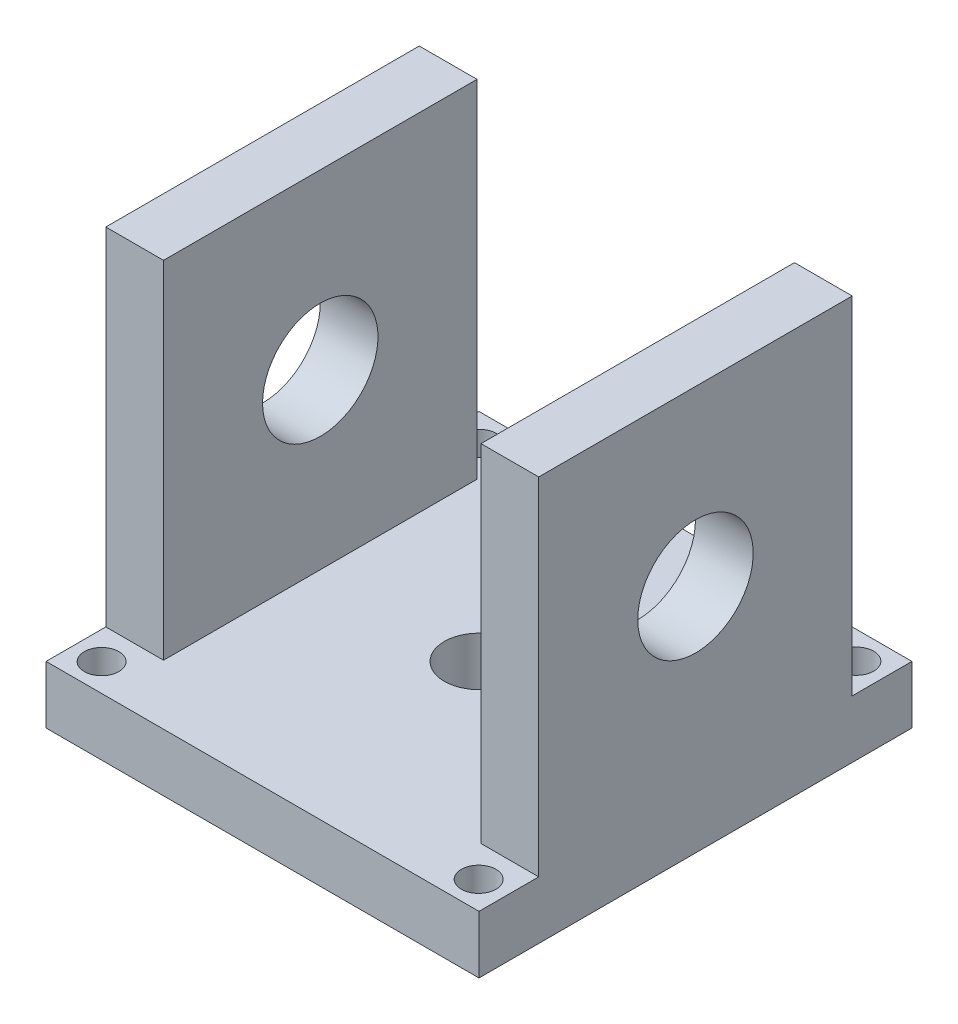
ISO-10303-21;
HEADER;
FILE_DESCRIPTION(('STEP AP214'),'2;1');
FILE_NAME('part.step','',(''),(''),'','','');
FILE_SCHEMA(('AUTOMOTIVE_DESIGN { 1 0 10303 214 1 1 1 1 }'));
ENDSEC;
DATA;
#1=APPLICATION_CONTEXT('core data for automotive mechanical design processes');
#2=APPLICATION_PROTOCOL_DEFINITION('international standard','automotive_design',2000,#1);
#3=PRODUCT_CONTEXT('',#1,'mechanical');
#4=PRODUCT('Part','Part','',(#3));
#5=PRODUCT_RELATED_PRODUCT_CATEGORY('part','',(#4));
#6=PRODUCT_DEFINITION_FORMATION('','',#4);
#7=PRODUCT_DEFINITION_CONTEXT('part definition',#1,'design');
#8=PRODUCT_DEFINITION('design','',#6,#7);
#9=PRODUCT_DEFINITION_SHAPE('','',#8);
#10=(LENGTH_UNIT() NAMED_UNIT(*) SI_UNIT(.MILLI.,.METRE.));
#11=(NAMED_UNIT(*) PLANE_ANGLE_UNIT() SI_UNIT($,.RADIAN.));
#12=(NAMED_UNIT(*) SI_UNIT($,.STERADIAN.) SOLID_ANGLE_UNIT());
#13=UNCERTAINTY_MEASURE_WITH_UNIT(LENGTH_MEASURE(1.E-05),#10,'distance_accuracy_value','');
#14=(GEOMETRIC_REPRESENTATION_CONTEXT(3) GLOBAL_UNCERTAINTY_ASSIGNED_CONTEXT((#13)) GLOBAL_UNIT_ASSIGNED_CONTEXT((#10,
#11,#12)) REPRESENTATION_CONTEXT('',''));
#15=CARTESIAN_POINT('',(0.,0.,0.));
#16=DIRECTION('',(0.,0.,1.));
#17=DIRECTION('',(1.,0.,0.));
#18=AXIS2_PLACEMENT_3D('',#15,#16,#17);
#19=CARTESIAN_POINT('',(0.,10.,0.));
#20=DIRECTION('',(0.,-1.,0.));
#21=DIRECTION('',(0.,0.,-1.));
#22=AXIS2_PLACEMENT_3D('',#19,#20,#21);
#23=PLANE('',#22);
#24=CARTESIAN_POINT('',(-32.66,10.,-32.72));
#25=DIRECTION('',(0.,1.,0.));
#26=DIRECTION('',(0.,0.,1.));
#27=AXIS2_PLACEMENT_3D('',#24,#25,#26);
#28=CIRCLE('',#27,3.);
#29=CARTESIAN_POINT('',(-32.66,10.,-29.72));
#30=VERTEX_POINT('',#29);
#31=EDGE_CURVE('E210',#30,#30,#28,.T.);
#32=ORIENTED_EDGE('',*,*,#31,.F.);
#33=EDGE_LOOP('',(#32));
#34=FACE_BOUND('',#33,.T.);
#35=CARTESIAN_POINT('',(32.66,10.,-32.72));
#36=DIRECTION('',(0.,1.,0.));
#37=DIRECTION('',(0.,0.,-1.));
#38=AXIS2_PLACEMENT_3D('',#35,#36,#37);
#39=CIRCLE('',#38,3.);
#40=CARTESIAN_POINT('',(32.66,10.,-35.72));
#41=VERTEX_POINT('',#40);
#42=EDGE_CURVE('E204',#41,#41,#39,.T.);
#43=ORIENTED_EDGE('',*,*,#42,.F.);
#44=EDGE_LOOP('',(#43));
#45=FACE_BOUND('',#44,.T.);
#46=CARTESIAN_POINT('',(32.66,10.,32.72));
#47=DIRECTION('',(0.,1.,0.));
#48=DIRECTION('',(0.,0.,1.));
#49=AXIS2_PLACEMENT_3D('',#46,#47,#48);
#50=CIRCLE('',#49,3.);
#51=CARTESIAN_POINT('',(32.66,10.,35.72));
#52=VERTEX_POINT('',#51);
#53=EDGE_CURVE('E198',#52,#52,#50,.T.);
#54=ORIENTED_EDGE('',*,*,#53,.F.);
#55=EDGE_LOOP('',(#54));
#56=FACE_BOUND('',#55,.T.);
#57=CARTESIAN_POINT('',(-32.66,10.,32.72));
#58=DIRECTION('',(0.,1.,0.));
#59=DIRECTION('',(0.,0.,-1.));
#60=AXIS2_PLACEMENT_3D('',#57,#58,#59);
#61=CIRCLE('',#60,3.);
#62=CARTESIAN_POINT('',(-32.66,10.,29.72));
#63=VERTEX_POINT('',#62);
#64=EDGE_CURVE('E192',#63,#63,#61,.T.);
#65=ORIENTED_EDGE('',*,*,#64,.F.);
#66=EDGE_LOOP('',(#65));
#67=FACE_BOUND('',#66,.T.);
#68=CARTESIAN_POINT('',(0.,10.,0.));
#69=DIRECTION('',(0.,1.,0.));
#70=DIRECTION('',(0.,0.,1.));
#71=AXIS2_PLACEMENT_3D('',#68,#69,#70);
#72=CIRCLE('',#71,6.);
#73=CARTESIAN_POINT('',(0.,10.,6.));
#74=VERTEX_POINT('',#73);
#75=EDGE_CURVE('E186',#74,#74,#72,.T.);
#76=ORIENTED_EDGE('',*,*,#75,.F.);
#77=EDGE_LOOP('',(#76));
#78=FACE_BOUND('',#77,.T.);
#79=DIRECTION('',(-1.,0.,0.));
#80=VECTOR('',#79,1.);
#81=CARTESIAN_POINT('',(37.5,10.,-27.154127805021));
#82=LINE('',#81,#80);
#83=CARTESIAN_POINT('',(37.5,10.,-27.154127805021));
#84=VERTEX_POINT('',#83);
#85=CARTESIAN_POINT('',(27.5,10.,-27.154127805021));
#86=VERTEX_POINT('',#85);
#87=EDGE_CURVE('E468',#84,#86,#82,.T.);
#88=ORIENTED_EDGE('',*,*,#87,.F.);
#89=DIRECTION('',(0.,0.,-1.));
#90=VECTOR('',#89,1.);
#91=CARTESIAN_POINT('',(37.5,10.,-37.5));
#92=LINE('',#91,#90);
#93=CARTESIAN_POINT('',(37.5,10.,-37.5));
#94=VERTEX_POINT('',#93);
#95=EDGE_CURVE('E149',#84,#94,#92,.T.);
#96=ORIENTED_EDGE('',*,*,#95,.T.);
#97=DIRECTION('',(-1.,0.,0.));
#98=VECTOR('',#97,1.);
#99=CARTESIAN_POINT('',(37.5,10.,-37.5));
#100=LINE('',#99,#98);
#101=CARTESIAN_POINT('',(-37.5,10.,-37.5));
#102=VERTEX_POINT('',#101);
#103=EDGE_CURVE('E223',#94,#102,#100,.T.);
#104=ORIENTED_EDGE('',*,*,#103,.T.);
#105=DIRECTION('',(0.,0.,1.));
#106=VECTOR('',#105,1.);
#107=CARTESIAN_POINT('',(-37.5,10.,-37.5));
#108=LINE('',#107,#106);
#109=CARTESIAN_POINT('',(-37.5,10.,-27.154127805021));
#110=VERTEX_POINT('',#109);
#111=EDGE_CURVE('E216',#102,#110,#108,.T.);
#112=ORIENTED_EDGE('',*,*,#111,.T.);
#113=DIRECTION('',(-1.,0.,0.));
#114=VECTOR('',#113,1.);
#115=CARTESIAN_POINT('',(-37.5,10.,-27.154127805021));
#116=LINE('',#115,#114);
#117=CARTESIAN_POINT('',(-27.5,10.,-27.154127805021));
#118=VERTEX_POINT('',#117);
#119=EDGE_CURVE('E163',#118,#110,#116,.T.);
#120=ORIENTED_EDGE('',*,*,#119,.F.);
#121=DIRECTION('',(0.,0.,-1.));
#122=VECTOR('',#121,1.);
#123=CARTESIAN_POINT('',(-27.5,10.,-27.154127805021));
#124=LINE('',#123,#122);
#125=CARTESIAN_POINT('',(-27.5,10.,27.154127805021));
#126=VERTEX_POINT('',#125);
#127=EDGE_CURVE('E153',#126,#118,#124,.T.);
#128=ORIENTED_EDGE('',*,*,#127,.F.);
#129=DIRECTION('',(1.,0.,0.));
#130=VECTOR('',#129,1.);
#131=CARTESIAN_POINT('',(-37.5,10.,27.154127805021));
#132=LINE('',#131,#130);
#133=CARTESIAN_POINT('',(-37.5,10.,27.154127805021));
#134=VERTEX_POINT('',#133);
#135=EDGE_CURVE('E150',#134,#126,#132,.T.);
#136=ORIENTED_EDGE('',*,*,#135,.F.);
#137=CARTESIAN_POINT('',(-37.5,10.,37.5));
#138=VERTEX_POINT('',#137);
#139=EDGE_CURVE('E219',#134,#138,#108,.T.);
#140=ORIENTED_EDGE('',*,*,#139,.T.);
#141=DIRECTION('',(1.,0.,0.));
#142=VECTOR('',#141,1.);
#143=CARTESIAN_POINT('',(37.5,10.,37.5));
#144=LINE('',#143,#142);
#145=CARTESIAN_POINT('',(37.5,10.,37.5));
#146=VERTEX_POINT('',#145);
#147=EDGE_CURVE('E218',#138,#146,#144,.T.);
#148=ORIENTED_EDGE('',*,*,#147,.T.);
#149=CARTESIAN_POINT('',(37.5,10.,27.154127805021));
#150=VERTEX_POINT('',#149);
#151=EDGE_CURVE('E221',#146,#150,#92,.T.);
#152=ORIENTED_EDGE('',*,*,#151,.T.);
#153=DIRECTION('',(1.,0.,0.));
#154=VECTOR('',#153,1.);
#155=CARTESIAN_POINT('',(37.5,10.,27.154127805021));
#156=LINE('',#155,#154);
#157=CARTESIAN_POINT('',(27.5,10.,27.154127805021));
#158=VERTEX_POINT('',#157);
#159=EDGE_CURVE('E59',#158,#150,#156,.T.);
#160=ORIENTED_EDGE('',*,*,#159,.F.);
#161=DIRECTION('',(0.,0.,1.));
#162=VECTOR('',#161,1.);
#163=CARTESIAN_POINT('',(27.5,10.,-27.154127805021));
#164=LINE('',#163,#162);
#165=EDGE_CURVE('E54',#86,#158,#164,.T.);
#166=ORIENTED_EDGE('',*,*,#165,.F.);
#167=EDGE_LOOP('',(#88,#96,#104,#112,#120,#128,#136,#140,#148,#152,#160,#166));
#168=FACE_BOUND('',#167,.T.);
#169=ADVANCED_FACE('F38',(#34,#45,#56,#67,#78,#168),#23,.F.);
#170=CARTESIAN_POINT('',(0.,0.,0.));
#171=DIRECTION('',(0.,-1.,0.));
#172=DIRECTION('',(0.,0.,-1.));
#173=AXIS2_PLACEMENT_3D('',#170,#171,#172);
#174=PLANE('',#173);
#175=CARTESIAN_POINT('',(-32.66,0.,32.72));
#176=DIRECTION('',(0.,1.,0.));
#177=DIRECTION('',(0.,0.,-1.));
#178=AXIS2_PLACEMENT_3D('',#175,#176,#177);
#179=CIRCLE('',#178,3.);
#180=CARTESIAN_POINT('',(-32.66,0.,29.72));
#181=VERTEX_POINT('',#180);
#182=EDGE_CURVE('E189',#181,#181,#179,.T.);
#183=ORIENTED_EDGE('',*,*,#182,.T.);
#184=EDGE_LOOP('',(#183));
#185=FACE_BOUND('',#184,.T.);
#186=CARTESIAN_POINT('',(32.66,0.,-32.72));
#187=DIRECTION('',(0.,1.,0.));
#188=DIRECTION('',(0.,0.,-1.));
#189=AXIS2_PLACEMENT_3D('',#186,#187,#188);
#190=CIRCLE('',#189,3.);
#191=CARTESIAN_POINT('',(32.66,0.,-35.72));
#192=VERTEX_POINT('',#191);
#193=EDGE_CURVE('E201',#192,#192,#190,.T.);
#194=ORIENTED_EDGE('',*,*,#193,.T.);
#195=EDGE_LOOP('',(#194));
#196=FACE_BOUND('',#195,.T.);
#197=DIRECTION('',(0.,0.,1.));
#198=VECTOR('',#197,1.);
#199=CARTESIAN_POINT('',(-37.5,0.,-37.5));
#200=LINE('',#199,#198);
#201=CARTESIAN_POINT('',(-37.5,0.,-37.5));
#202=VERTEX_POINT('',#201);
#203=CARTESIAN_POINT('',(-37.5,0.,37.5));
#204=VERTEX_POINT('',#203);
#205=EDGE_CURVE('E213',#202,#204,#200,.T.);
#206=ORIENTED_EDGE('',*,*,#205,.F.);
#207=DIRECTION('',(-1.,0.,0.));
#208=VECTOR('',#207,1.);
#209=CARTESIAN_POINT('',(37.5,0.,-37.5));
#210=LINE('',#209,#208);
#211=CARTESIAN_POINT('',(37.5,0.,-37.5));
#212=VERTEX_POINT('',#211);
#213=EDGE_CURVE('E232',#212,#202,#210,.T.);
#214=ORIENTED_EDGE('',*,*,#213,.F.);
#215=DIRECTION('',(0.,0.,-1.));
#216=VECTOR('',#215,1.);
#217=CARTESIAN_POINT('',(37.5,0.,-37.5));
#218=LINE('',#217,#216);
#219=CARTESIAN_POINT('',(37.5,0.,37.5));
#220=VERTEX_POINT('',#219);
#221=EDGE_CURVE('E230',#220,#212,#218,.T.);
#222=ORIENTED_EDGE('',*,*,#221,.F.);
#223=DIRECTION('',(1.,0.,0.));
#224=VECTOR('',#223,1.);
#225=CARTESIAN_POINT('',(37.5,0.,37.5));
#226=LINE('',#225,#224);
#227=EDGE_CURVE('E228',#204,#220,#226,.T.);
#228=ORIENTED_EDGE('',*,*,#227,.F.);
#229=EDGE_LOOP('',(#206,#214,#222,#228));
#230=FACE_BOUND('',#229,.T.);
#231=CARTESIAN_POINT('',(-32.66,0.,-32.72));
#232=DIRECTION('',(0.,1.,0.));
#233=DIRECTION('',(0.,0.,1.));
#234=AXIS2_PLACEMENT_3D('',#231,#232,#233);
#235=CIRCLE('',#234,3.);
#236=CARTESIAN_POINT('',(-32.66,0.,-29.72));
#237=VERTEX_POINT('',#236);
#238=EDGE_CURVE('E207',#237,#237,#235,.T.);
#239=ORIENTED_EDGE('',*,*,#238,.T.);
#240=EDGE_LOOP('',(#239));
#241=FACE_BOUND('',#240,.T.);
#242=CARTESIAN_POINT('',(32.66,0.,32.72));
#243=DIRECTION('',(0.,1.,0.));
#244=DIRECTION('',(0.,0.,1.));
#245=AXIS2_PLACEMENT_3D('',#242,#243,#244);
#246=CIRCLE('',#245,3.);
#247=CARTESIAN_POINT('',(32.66,0.,35.72));
#248=VERTEX_POINT('',#247);
#249=EDGE_CURVE('E195',#248,#248,#246,.T.);
#250=ORIENTED_EDGE('',*,*,#249,.T.);
#251=EDGE_LOOP('',(#250));
#252=FACE_BOUND('',#251,.T.);
#253=CARTESIAN_POINT('',(0.,0.,0.));
#254=DIRECTION('',(0.,1.,0.));
#255=DIRECTION('',(0.,0.,1.));
#256=AXIS2_PLACEMENT_3D('',#253,#254,#255);
#257=CIRCLE('',#256,6.);
#258=CARTESIAN_POINT('',(0.,0.,6.));
#259=VERTEX_POINT('',#258);
#260=EDGE_CURVE('E185',#259,#259,#257,.T.);
#261=ORIENTED_EDGE('',*,*,#260,.T.);
#262=EDGE_LOOP('',(#261));
#263=FACE_BOUND('',#262,.T.);
#264=ADVANCED_FACE('F248',(#185,#196,#230,#241,#252,#263),#174,.T.);
#265=CARTESIAN_POINT('',(-37.5,10.,-37.5));
#266=DIRECTION('',(1.,0.,0.));
#267=DIRECTION('',(0.,0.,-1.));
#268=AXIS2_PLACEMENT_3D('',#265,#266,#267);
#269=PLANE('',#268);
#270=CARTESIAN_POINT('',(-37.5,40.,0.));
#271=DIRECTION('',(1.,0.,0.));
#272=DIRECTION('',(0.,0.,-1.));
#273=AXIS2_PLACEMENT_3D('',#270,#271,#272);
#274=CIRCLE('',#273,10.);
#275=CARTESIAN_POINT('',(-37.5,40.,-10.));
#276=VERTEX_POINT('',#275);
#277=EDGE_CURVE('E467',#276,#276,#274,.T.);
#278=ORIENTED_EDGE('',*,*,#277,.T.);
#279=EDGE_LOOP('',(#278));
#280=FACE_BOUND('',#279,.T.);
#281=ORIENTED_EDGE('',*,*,#205,.T.);
#282=DIRECTION('',(0.,-1.,0.));
#283=VECTOR('',#282,1.);
#284=CARTESIAN_POINT('',(-37.5,10.,37.5));
#285=LINE('',#284,#283);
#286=EDGE_CURVE('E11',#138,#204,#285,.T.);
#287=ORIENTED_EDGE('',*,*,#286,.F.);
#288=ORIENTED_EDGE('',*,*,#139,.F.);
#289=DIRECTION('',(0.,-1.,0.));
#290=VECTOR('',#289,1.);
#291=CARTESIAN_POINT('',(-37.5,70.,27.154127805021));
#292=LINE('',#291,#290);
#293=CARTESIAN_POINT('',(-37.5,70.,27.154127805021));
#294=VERTEX_POINT('',#293);
#295=EDGE_CURVE('E182',#294,#134,#292,.T.);
#296=ORIENTED_EDGE('',*,*,#295,.F.);
#297=DIRECTION('',(0.,0.,1.));
#298=VECTOR('',#297,1.);
#299=CARTESIAN_POINT('',(-37.5,70.,-27.154127805021));
#300=LINE('',#299,#298);
#301=CARTESIAN_POINT('',(-37.5,70.,-27.154127805021));
#302=VERTEX_POINT('',#301);
#303=EDGE_CURVE('E159',#302,#294,#300,.T.);
#304=ORIENTED_EDGE('',*,*,#303,.F.);
#305=DIRECTION('',(0.,-1.,0.));
#306=VECTOR('',#305,1.);
#307=CARTESIAN_POINT('',(-37.5,70.,-27.154127805021));
#308=LINE('',#307,#306);
#309=EDGE_CURVE('E168',#302,#110,#308,.T.);
#310=ORIENTED_EDGE('',*,*,#309,.T.);
#311=ORIENTED_EDGE('',*,*,#111,.F.);
#312=DIRECTION('',(0.,-1.,0.));
#313=VECTOR('',#312,1.);
#314=CARTESIAN_POINT('',(-37.5,10.,-37.5));
#315=LINE('',#314,#313);
#316=EDGE_CURVE('E225',#102,#202,#315,.T.);
#317=ORIENTED_EDGE('',*,*,#316,.T.);
#318=EDGE_LOOP('',(#281,#287,#288,#296,#304,#310,#311,#317));
#319=FACE_BOUND('',#318,.T.);
#320=ADVANCED_FACE('F40',(#280,#319),#269,.F.);
#321=CARTESIAN_POINT('',(37.5,10.,37.5));
#322=DIRECTION('',(0.,0.,-1.));
#323=DIRECTION('',(-1.,0.,0.));
#324=AXIS2_PLACEMENT_3D('',#321,#322,#323);
#325=PLANE('',#324);
#326=ORIENTED_EDGE('',*,*,#227,.T.);
#327=DIRECTION('',(0.,-1.,0.));
#328=VECTOR('',#327,1.);
#329=CARTESIAN_POINT('',(37.5,10.,37.5));
#330=LINE('',#329,#328);
#331=EDGE_CURVE('E47',#146,#220,#330,.T.);
#332=ORIENTED_EDGE('',*,*,#331,.F.);
#333=ORIENTED_EDGE('',*,*,#147,.F.);
#334=ORIENTED_EDGE('',*,*,#286,.T.);
#335=EDGE_LOOP('',(#326,#332,#333,#334));
#336=FACE_BOUND('',#335,.T.);
#337=ADVANCED_FACE('F271',(#336),#325,.F.);
#338=CARTESIAN_POINT('',(37.5,10.,-37.5));
#339=DIRECTION('',(-1.,0.,0.));
#340=DIRECTION('',(0.,0.,1.));
#341=AXIS2_PLACEMENT_3D('',#338,#339,#340);
#342=PLANE('',#341);
#343=CARTESIAN_POINT('',(37.5,40.,0.));
#344=DIRECTION('',(-1.,0.,0.));
#345=DIRECTION('',(0.,0.,1.));
#346=AXIS2_PLACEMENT_3D('',#343,#344,#345);
#347=CIRCLE('',#346,10.);
#348=CARTESIAN_POINT('',(37.5,40.,10.));
#349=VERTEX_POINT('',#348);
#350=EDGE_CURVE('E482',#349,#349,#347,.T.);
#351=ORIENTED_EDGE('',*,*,#350,.T.);
#352=EDGE_LOOP('',(#351));
#353=FACE_BOUND('',#352,.T.);
#354=ORIENTED_EDGE('',*,*,#221,.T.);
#355=DIRECTION('',(0.,-1.,0.));
#356=VECTOR('',#355,1.);
#357=CARTESIAN_POINT('',(37.5,10.,-37.5));
#358=LINE('',#357,#356);
#359=EDGE_CURVE('E236',#94,#212,#358,.T.);
#360=ORIENTED_EDGE('',*,*,#359,.F.);
#361=ORIENTED_EDGE('',*,*,#95,.F.);
#362=DIRECTION('',(0.,-1.,0.));
#363=VECTOR('',#362,1.);
#364=CARTESIAN_POINT('',(37.5,70.,-27.154127805021));
#365=LINE('',#364,#363);
#366=CARTESIAN_POINT('',(37.5,70.,-27.154127805021));
#367=VERTEX_POINT('',#366);
#368=EDGE_CURVE('E131',#367,#84,#365,.T.);
#369=ORIENTED_EDGE('',*,*,#368,.F.);
#370=DIRECTION('',(0.,0.,-1.));
#371=VECTOR('',#370,1.);
#372=CARTESIAN_POINT('',(37.5,70.,-27.154127805021));
#373=LINE('',#372,#371);
#374=CARTESIAN_POINT('',(37.5,70.,27.154127805021));
#375=VERTEX_POINT('',#374);
#376=EDGE_CURVE('E137',#375,#367,#373,.T.);
#377=ORIENTED_EDGE('',*,*,#376,.F.);
#378=DIRECTION('',(0.,-1.,0.));
#379=VECTOR('',#378,1.);
#380=CARTESIAN_POINT('',(37.5,70.,27.154127805021));
#381=LINE('',#380,#379);
#382=EDGE_CURVE('E475',#375,#150,#381,.T.);
#383=ORIENTED_EDGE('',*,*,#382,.T.);
#384=ORIENTED_EDGE('',*,*,#151,.F.);
#385=ORIENTED_EDGE('',*,*,#331,.T.);
#386=EDGE_LOOP('',(#354,#360,#361,#369,#377,#383,#384,#385));
#387=FACE_BOUND('',#386,.T.);
#388=ADVANCED_FACE('F147',(#353,#387),#342,.F.);
#389=CARTESIAN_POINT('',(37.5,10.,-37.5));
#390=DIRECTION('',(0.,0.,1.));
#391=DIRECTION('',(1.,0.,0.));
#392=AXIS2_PLACEMENT_3D('',#389,#390,#391);
#393=PLANE('',#392);
#394=ORIENTED_EDGE('',*,*,#213,.T.);
#395=ORIENTED_EDGE('',*,*,#316,.F.);
#396=ORIENTED_EDGE('',*,*,#103,.F.);
#397=ORIENTED_EDGE('',*,*,#359,.T.);
#398=EDGE_LOOP('',(#394,#395,#396,#397));
#399=FACE_BOUND('',#398,.T.);
#400=ADVANCED_FACE('F252',(#399),#393,.F.);
#401=CARTESIAN_POINT('',(-32.66,10.,-32.72));
#402=DIRECTION('',(0.,-1.,0.));
#403=DIRECTION('',(0.,0.,-1.));
#404=AXIS2_PLACEMENT_3D('',#401,#402,#403);
#405=CYLINDRICAL_SURFACE('',#404,3.);
#406=ORIENTED_EDGE('',*,*,#31,.T.);
#407=EDGE_LOOP('',(#406));
#408=FACE_BOUND('',#407,.T.);
#409=ORIENTED_EDGE('',*,*,#238,.F.);
#410=EDGE_LOOP('',(#409));
#411=FACE_BOUND('',#410,.T.);
#412=ADVANCED_FACE('F291',(#408,#411),#405,.F.);
#413=CARTESIAN_POINT('',(32.66,10.,-32.72));
#414=DIRECTION('',(0.,-1.,0.));
#415=DIRECTION('',(0.,0.,-1.));
#416=AXIS2_PLACEMENT_3D('',#413,#414,#415);
#417=CYLINDRICAL_SURFACE('',#416,3.);
#418=ORIENTED_EDGE('',*,*,#42,.T.);
#419=EDGE_LOOP('',(#418));
#420=FACE_BOUND('',#419,.T.);
#421=ORIENTED_EDGE('',*,*,#193,.F.);
#422=EDGE_LOOP('',(#421));
#423=FACE_BOUND('',#422,.T.);
#424=ADVANCED_FACE('F298',(#420,#423),#417,.F.);
#425=CARTESIAN_POINT('',(32.66,10.,32.72));
#426=DIRECTION('',(0.,-1.,0.));
#427=DIRECTION('',(0.,0.,-1.));
#428=AXIS2_PLACEMENT_3D('',#425,#426,#427);
#429=CYLINDRICAL_SURFACE('',#428,3.);
#430=ORIENTED_EDGE('',*,*,#53,.T.);
#431=EDGE_LOOP('',(#430));
#432=FACE_BOUND('',#431,.T.);
#433=ORIENTED_EDGE('',*,*,#249,.F.);
#434=EDGE_LOOP('',(#433));
#435=FACE_BOUND('',#434,.T.);
#436=ADVANCED_FACE('F303',(#432,#435),#429,.F.);
#437=CARTESIAN_POINT('',(-32.66,10.,32.72));
#438=DIRECTION('',(0.,-1.,0.));
#439=DIRECTION('',(0.,0.,-1.));
#440=AXIS2_PLACEMENT_3D('',#437,#438,#439);
#441=CYLINDRICAL_SURFACE('',#440,3.);
#442=ORIENTED_EDGE('',*,*,#64,.T.);
#443=EDGE_LOOP('',(#442));
#444=FACE_BOUND('',#443,.T.);
#445=ORIENTED_EDGE('',*,*,#182,.F.);
#446=EDGE_LOOP('',(#445));
#447=FACE_BOUND('',#446,.T.);
#448=ADVANCED_FACE('F314',(#444,#447),#441,.F.);
#449=CARTESIAN_POINT('',(0.,10.,0.));
#450=DIRECTION('',(0.,-1.,0.));
#451=DIRECTION('',(0.,0.,-1.));
#452=AXIS2_PLACEMENT_3D('',#449,#450,#451);
#453=CYLINDRICAL_SURFACE('',#452,6.);
#454=ORIENTED_EDGE('',*,*,#75,.T.);
#455=EDGE_LOOP('',(#454));
#456=FACE_BOUND('',#455,.T.);
#457=ORIENTED_EDGE('',*,*,#260,.F.);
#458=EDGE_LOOP('',(#457));
#459=FACE_BOUND('',#458,.T.);
#460=ADVANCED_FACE('F312',(#456,#459),#453,.F.);
#461=CARTESIAN_POINT('',(-37.5,70.,27.154127805021));
#462=DIRECTION('',(0.,0.,-1.));
#463=DIRECTION('',(-1.,0.,0.));
#464=AXIS2_PLACEMENT_3D('',#461,#462,#463);
#465=PLANE('',#464);
#466=ORIENTED_EDGE('',*,*,#135,.T.);
#467=DIRECTION('',(0.,-1.,0.));
#468=VECTOR('',#467,1.);
#469=CARTESIAN_POINT('',(-27.5,70.,27.154127805021));
#470=LINE('',#469,#468);
#471=CARTESIAN_POINT('',(-27.5,70.,27.154127805021));
#472=VERTEX_POINT('',#471);
#473=EDGE_CURVE('E179',#472,#126,#470,.T.);
#474=ORIENTED_EDGE('',*,*,#473,.F.);
#475=DIRECTION('',(1.,0.,0.));
#476=VECTOR('',#475,1.);
#477=CARTESIAN_POINT('',(-37.5,70.,27.154127805021));
#478=LINE('',#477,#476);
#479=EDGE_CURVE('E162',#294,#472,#478,.T.);
#480=ORIENTED_EDGE('',*,*,#479,.F.);
#481=ORIENTED_EDGE('',*,*,#295,.T.);
#482=EDGE_LOOP('',(#466,#474,#480,#481));
#483=FACE_BOUND('',#482,.T.);
#484=ADVANCED_FACE('F269',(#483),#465,.F.);
#485=CARTESIAN_POINT('',(-27.5,70.,-27.154127805021));
#486=DIRECTION('',(-1.,0.,0.));
#487=DIRECTION('',(0.,0.,1.));
#488=AXIS2_PLACEMENT_3D('',#485,#486,#487);
#489=PLANE('',#488);
#490=CARTESIAN_POINT('',(-27.5,40.,0.));
#491=DIRECTION('',(-1.,0.,0.));
#492=DIRECTION('',(0.,0.,1.));
#493=AXIS2_PLACEMENT_3D('',#490,#491,#492);
#494=CIRCLE('',#493,10.);
#495=CARTESIAN_POINT('',(-27.5,40.,10.));
#496=VERTEX_POINT('',#495);
#497=EDGE_CURVE('E464',#496,#496,#494,.T.);
#498=ORIENTED_EDGE('',*,*,#497,.T.);
#499=EDGE_LOOP('',(#498));
#500=FACE_BOUND('',#499,.T.);
#501=ORIENTED_EDGE('',*,*,#127,.T.);
#502=DIRECTION('',(0.,-1.,0.));
#503=VECTOR('',#502,1.);
#504=CARTESIAN_POINT('',(-27.5,70.,-27.154127805021));
#505=LINE('',#504,#503);
#506=CARTESIAN_POINT('',(-27.5,70.,-27.154127805021));
#507=VERTEX_POINT('',#506);
#508=EDGE_CURVE('E176',#507,#118,#505,.T.);
#509=ORIENTED_EDGE('',*,*,#508,.F.);
#510=DIRECTION('',(0.,0.,-1.));
#511=VECTOR('',#510,1.);
#512=CARTESIAN_POINT('',(-27.5,70.,-27.154127805021));
#513=LINE('',#512,#511);
#514=EDGE_CURVE('E165',#472,#507,#513,.T.);
#515=ORIENTED_EDGE('',*,*,#514,.F.);
#516=ORIENTED_EDGE('',*,*,#473,.T.);
#517=EDGE_LOOP('',(#501,#509,#515,#516));
#518=FACE_BOUND('',#517,.T.);
#519=ADVANCED_FACE('F265',(#500,#518),#489,.F.);
#520=CARTESIAN_POINT('',(-37.5,70.,-27.154127805021));
#521=DIRECTION('',(0.,0.,1.));
#522=DIRECTION('',(1.,0.,0.));
#523=AXIS2_PLACEMENT_3D('',#520,#521,#522);
#524=PLANE('',#523);
#525=ORIENTED_EDGE('',*,*,#119,.T.);
#526=ORIENTED_EDGE('',*,*,#309,.F.);
#527=DIRECTION('',(-1.,0.,0.));
#528=VECTOR('',#527,1.);
#529=CARTESIAN_POINT('',(-37.5,70.,-27.154127805021));
#530=LINE('',#529,#528);
#531=EDGE_CURVE('E167',#507,#302,#530,.T.);
#532=ORIENTED_EDGE('',*,*,#531,.F.);
#533=ORIENTED_EDGE('',*,*,#508,.T.);
#534=EDGE_LOOP('',(#525,#526,#532,#533));
#535=FACE_BOUND('',#534,.T.);
#536=ADVANCED_FACE('F260',(#535),#524,.F.);
#537=CARTESIAN_POINT('',(0.,70.,0.));
#538=DIRECTION('',(0.,1.,0.));
#539=DIRECTION('',(0.,0.,1.));
#540=AXIS2_PLACEMENT_3D('',#537,#538,#539);
#541=PLANE('',#540);
#542=ORIENTED_EDGE('',*,*,#303,.T.);
#543=ORIENTED_EDGE('',*,*,#479,.T.);
#544=ORIENTED_EDGE('',*,*,#514,.T.);
#545=ORIENTED_EDGE('',*,*,#531,.T.);
#546=EDGE_LOOP('',(#542,#543,#544,#545));
#547=FACE_BOUND('',#546,.T.);
#548=ADVANCED_FACE('F375',(#547),#541,.T.);
#549=CARTESIAN_POINT('',(37.5,70.,-27.154127805021));
#550=DIRECTION('',(0.,0.,1.));
#551=DIRECTION('',(1.,0.,0.));
#552=AXIS2_PLACEMENT_3D('',#549,#550,#551);
#553=PLANE('',#552);
#554=ORIENTED_EDGE('',*,*,#87,.T.);
#555=DIRECTION('',(0.,-1.,0.));
#556=VECTOR('',#555,1.);
#557=CARTESIAN_POINT('',(27.5,70.,-27.154127805021));
#558=LINE('',#557,#556);
#559=CARTESIAN_POINT('',(27.5,70.,-27.154127805021));
#560=VERTEX_POINT('',#559);
#561=EDGE_CURVE('E133',#560,#86,#558,.T.);
#562=ORIENTED_EDGE('',*,*,#561,.F.);
#563=DIRECTION('',(-1.,0.,0.));
#564=VECTOR('',#563,1.);
#565=CARTESIAN_POINT('',(37.5,70.,-27.154127805021));
#566=LINE('',#565,#564);
#567=EDGE_CURVE('E127',#367,#560,#566,.T.);
#568=ORIENTED_EDGE('',*,*,#567,.F.);
#569=ORIENTED_EDGE('',*,*,#368,.T.);
#570=EDGE_LOOP('',(#554,#562,#568,#569));
#571=FACE_BOUND('',#570,.T.);
#572=ADVANCED_FACE('F129',(#571),#553,.F.);
#573=CARTESIAN_POINT('',(27.5,70.,-27.154127805021));
#574=DIRECTION('',(1.,0.,0.));
#575=DIRECTION('',(0.,0.,-1.));
#576=AXIS2_PLACEMENT_3D('',#573,#574,#575);
#577=PLANE('',#576);
#578=CARTESIAN_POINT('',(27.5,40.,0.));
#579=DIRECTION('',(1.,0.,0.));
#580=DIRECTION('',(0.,0.,-1.));
#581=AXIS2_PLACEMENT_3D('',#578,#579,#580);
#582=CIRCLE('',#581,10.);
#583=CARTESIAN_POINT('',(27.5,40.,-10.));
#584=VERTEX_POINT('',#583);
#585=EDGE_CURVE('E42',#584,#584,#582,.T.);
#586=ORIENTED_EDGE('',*,*,#585,.T.);
#587=EDGE_LOOP('',(#586));
#588=FACE_BOUND('',#587,.T.);
#589=ORIENTED_EDGE('',*,*,#165,.T.);
#590=DIRECTION('',(0.,-1.,0.));
#591=VECTOR('',#590,1.);
#592=CARTESIAN_POINT('',(27.5,70.,27.154127805021));
#593=LINE('',#592,#591);
#594=CARTESIAN_POINT('',(27.5,70.,27.154127805021));
#595=VERTEX_POINT('',#594);
#596=EDGE_CURVE('E155',#595,#158,#593,.T.);
#597=ORIENTED_EDGE('',*,*,#596,.F.);
#598=DIRECTION('',(0.,0.,1.));
#599=VECTOR('',#598,1.);
#600=CARTESIAN_POINT('',(27.5,70.,-27.154127805021));
#601=LINE('',#600,#599);
#602=EDGE_CURVE('E136',#560,#595,#601,.T.);
#603=ORIENTED_EDGE('',*,*,#602,.F.);
#604=ORIENTED_EDGE('',*,*,#561,.T.);
#605=EDGE_LOOP('',(#589,#597,#603,#604));
#606=FACE_BOUND('',#605,.T.);
#607=ADVANCED_FACE('F393',(#588,#606),#577,.F.);
#608=CARTESIAN_POINT('',(37.5,70.,27.154127805021));
#609=DIRECTION('',(0.,0.,-1.));
#610=DIRECTION('',(-1.,0.,0.));
#611=AXIS2_PLACEMENT_3D('',#608,#609,#610);
#612=PLANE('',#611);
#613=ORIENTED_EDGE('',*,*,#159,.T.);
#614=ORIENTED_EDGE('',*,*,#382,.F.);
#615=DIRECTION('',(1.,0.,0.));
#616=VECTOR('',#615,1.);
#617=CARTESIAN_POINT('',(37.5,70.,27.154127805021));
#618=LINE('',#617,#616);
#619=EDGE_CURVE('E142',#595,#375,#618,.T.);
#620=ORIENTED_EDGE('',*,*,#619,.F.);
#621=ORIENTED_EDGE('',*,*,#596,.T.);
#622=EDGE_LOOP('',(#613,#614,#620,#621));
#623=FACE_BOUND('',#622,.T.);
#624=ADVANCED_FACE('F400',(#623),#612,.F.);
#625=CARTESIAN_POINT('',(0.,70.,0.));
#626=DIRECTION('',(0.,-1.,0.));
#627=DIRECTION('',(0.,0.,-1.));
#628=AXIS2_PLACEMENT_3D('',#625,#626,#627);
#629=PLANE('',#628);
#630=ORIENTED_EDGE('',*,*,#376,.T.);
#631=ORIENTED_EDGE('',*,*,#567,.T.);
#632=ORIENTED_EDGE('',*,*,#602,.T.);
#633=ORIENTED_EDGE('',*,*,#619,.T.);
#634=EDGE_LOOP('',(#630,#631,#632,#633));
#635=FACE_BOUND('',#634,.T.);
#636=ADVANCED_FACE('F140',(#635),#629,.F.);
#637=CARTESIAN_POINT('',(37.5,40.,0.));
#638=DIRECTION('',(-1.,0.,0.));
#639=DIRECTION('',(0.,0.,1.));
#640=AXIS2_PLACEMENT_3D('',#637,#638,#639);
#641=CYLINDRICAL_SURFACE('',#640,10.);
#642=ORIENTED_EDGE('',*,*,#350,.F.);
#643=EDGE_LOOP('',(#642));
#644=FACE_BOUND('',#643,.T.);
#645=ORIENTED_EDGE('',*,*,#585,.F.);
#646=EDGE_LOOP('',(#645));
#647=FACE_BOUND('',#646,.T.);
#648=ADVANCED_FACE('F414',(#644,#647),#641,.F.);
#649=ORIENTED_EDGE('',*,*,#497,.F.);
#650=EDGE_LOOP('',(#649));
#651=FACE_BOUND('',#650,.T.);
#652=ORIENTED_EDGE('',*,*,#277,.F.);
#653=EDGE_LOOP('',(#652));
#654=FACE_BOUND('',#653,.T.);
#655=ADVANCED_FACE('F448',(#651,#654),#641,.F.);
#656=CLOSED_SHELL('',(#169,#264,#320,#337,#388,#400,#412,#424,#436,#448,#460,#484,#519,#536,
#548,#572,#607,#624,#636,#648,#655));
#657=MANIFOLD_SOLID_BREP('B2',#656);
#658=ADVANCED_BREP_SHAPE_REPRESENTATION('',(#18,#657),#14);
#659=SHAPE_DEFINITION_REPRESENTATION(#9,#658);
ENDSEC;
END-ISO-10303-21;
